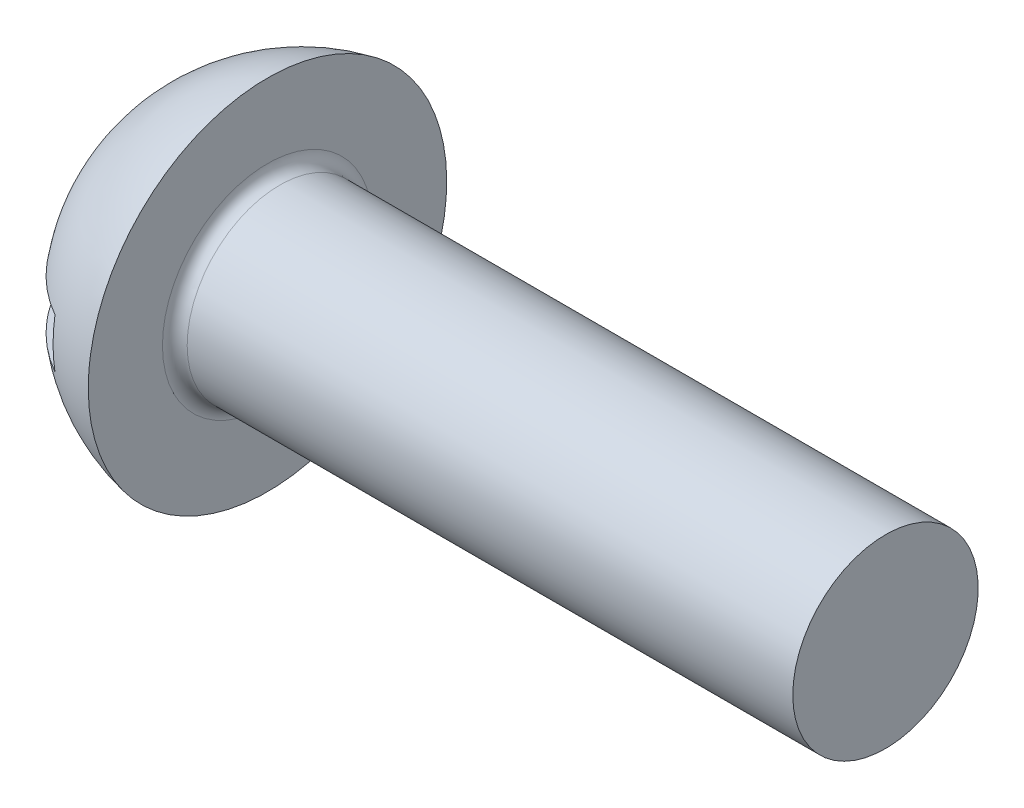
ISO-10303-21;
HEADER;
FILE_DESCRIPTION(('STEP AP214'),'2;1');
FILE_NAME('part.step','',(''),(''),'','','');
FILE_SCHEMA(('AUTOMOTIVE_DESIGN { 1 0 10303 214 1 1 1 1 }'));
ENDSEC;
DATA;
#1=APPLICATION_CONTEXT('core data for automotive mechanical design processes');
#2=APPLICATION_PROTOCOL_DEFINITION('international standard','automotive_design',2000,#1);
#3=PRODUCT_CONTEXT('',#1,'mechanical');
#4=PRODUCT('Part','Part','',(#3));
#5=PRODUCT_RELATED_PRODUCT_CATEGORY('part','',(#4));
#6=PRODUCT_DEFINITION_FORMATION('','',#4);
#7=PRODUCT_DEFINITION_CONTEXT('part definition',#1,'design');
#8=PRODUCT_DEFINITION('design','',#6,#7);
#9=PRODUCT_DEFINITION_SHAPE('','',#8);
#10=(LENGTH_UNIT() NAMED_UNIT(*) SI_UNIT(.MILLI.,.METRE.));
#11=(NAMED_UNIT(*) PLANE_ANGLE_UNIT() SI_UNIT($,.RADIAN.));
#12=(NAMED_UNIT(*) SI_UNIT($,.STERADIAN.) SOLID_ANGLE_UNIT());
#13=UNCERTAINTY_MEASURE_WITH_UNIT(LENGTH_MEASURE(1.E-05),#10,'distance_accuracy_value','');
#14=(GEOMETRIC_REPRESENTATION_CONTEXT(3) GLOBAL_UNCERTAINTY_ASSIGNED_CONTEXT((#13)) GLOBAL_UNIT_ASSIGNED_CONTEXT((#10,
#11,#12)) REPRESENTATION_CONTEXT('',''));
#15=CARTESIAN_POINT('',(0.,0.,0.));
#16=DIRECTION('',(0.,0.,1.));
#17=DIRECTION('',(1.,0.,0.));
#18=AXIS2_PLACEMENT_3D('',#15,#16,#17);
#19=CARTESIAN_POINT('',(2.95208333333333,0.,0.));
#20=DIRECTION('',(-1.,0.,0.));
#21=DIRECTION('',(0.,1.,0.));
#22=AXIS2_PLACEMENT_3D('',#19,#20,#21);
#23=SPHERICAL_SURFACE('',#22,2.95208333333333);
#24=CARTESIAN_POINT('',(2.95208333333333,0.4,0.));
#25=DIRECTION('',(0.,-1.,0.));
#26=DIRECTION('',(0.,0.,-1.));
#27=AXIS2_PLACEMENT_3D('',#24,#25,#26);
#28=CIRCLE('',#27,2.92485828835252);
#29=CARTESIAN_POINT('',(1.5,0.4,2.53894663197161));
#30=VERTEX_POINT('',#29);
#31=CARTESIAN_POINT('',(1.5,0.4,-2.53894663197161));
#32=VERTEX_POINT('',#31);
#33=EDGE_CURVE('E79',#30,#32,#28,.T.);
#34=ORIENTED_EDGE('',*,*,#33,.F.);
#35=CARTESIAN_POINT('',(1.5,0.,0.));
#36=DIRECTION('',(1.,0.,0.));
#37=DIRECTION('',(0.,0.,-1.));
#38=AXIS2_PLACEMENT_3D('',#35,#36,#37);
#39=CIRCLE('',#38,2.57026263249498);
#40=CARTESIAN_POINT('',(1.5,-0.4,2.53894663197161));
#41=VERTEX_POINT('',#40);
#42=EDGE_CURVE('E73',#30,#41,#39,.T.);
#43=ORIENTED_EDGE('',*,*,#42,.T.);
#44=CARTESIAN_POINT('',(2.95208333333333,-0.4,0.));
#45=DIRECTION('',(0.,1.,0.));
#46=DIRECTION('',(0.,0.,1.));
#47=AXIS2_PLACEMENT_3D('',#44,#45,#46);
#48=CIRCLE('',#47,2.92485828835252);
#49=CARTESIAN_POINT('',(1.5,-0.4,-2.53894663197161));
#50=VERTEX_POINT('',#49);
#51=EDGE_CURVE('E85',#50,#41,#48,.T.);
#52=ORIENTED_EDGE('',*,*,#51,.F.);
#53=EDGE_CURVE('E66',#50,#32,#39,.T.);
#54=ORIENTED_EDGE('',*,*,#53,.T.);
#55=EDGE_LOOP('',(#34,#43,#52,#54));
#56=FACE_BOUND('',#55,.T.);
#57=CARTESIAN_POINT('',(2.4,0.,0.));
#58=DIRECTION('',(-1.,0.,0.));
#59=DIRECTION('',(0.,0.,1.));
#60=AXIS2_PLACEMENT_3D('',#57,#58,#59);
#61=CIRCLE('',#60,2.9);
#62=CARTESIAN_POINT('',(2.4,0.,2.9));
#63=VERTEX_POINT('',#62);
#64=EDGE_CURVE('E130',#63,#63,#61,.T.);
#65=ORIENTED_EDGE('',*,*,#64,.T.);
#66=EDGE_LOOP('',(#65));
#67=FACE_BOUND('',#66,.T.);
#68=ADVANCED_FACE('F45',(#56,#67),#23,.T.);
#69=CARTESIAN_POINT('',(2.4,2.9,0.));
#70=DIRECTION('',(-1.,0.,0.));
#71=DIRECTION('',(0.,0.,1.));
#72=AXIS2_PLACEMENT_3D('',#69,#70,#71);
#73=PLANE('',#72);
#74=CARTESIAN_POINT('',(2.4,0.,0.));
#75=DIRECTION('',(-1.,0.,0.));
#76=DIRECTION('',(0.,0.,1.));
#77=AXIS2_PLACEMENT_3D('',#74,#75,#76);
#78=CIRCLE('',#77,1.7);
#79=CARTESIAN_POINT('',(2.4,0.,1.7));
#80=VERTEX_POINT('',#79);
#81=EDGE_CURVE('E54',#80,#80,#78,.T.);
#82=ORIENTED_EDGE('',*,*,#81,.T.);
#83=EDGE_LOOP('',(#82));
#84=FACE_BOUND('',#83,.T.);
#85=ORIENTED_EDGE('',*,*,#64,.F.);
#86=EDGE_LOOP('',(#85));
#87=FACE_BOUND('',#86,.T.);
#88=ADVANCED_FACE('F94',(#84,#87),#73,.F.);
#89=CARTESIAN_POINT('',(0.,0.,0.));
#90=DIRECTION('',(-1.,0.,0.));
#91=DIRECTION('',(0.,0.,1.));
#92=AXIS2_PLACEMENT_3D('',#89,#90,#91);
#93=CYLINDRICAL_SURFACE('',#92,1.5);
#94=CARTESIAN_POINT('',(2.6,0.,0.));
#95=DIRECTION('',(-1.,0.,0.));
#96=DIRECTION('',(0.,0.,1.));
#97=AXIS2_PLACEMENT_3D('',#94,#95,#96);
#98=CIRCLE('',#97,1.5);
#99=CARTESIAN_POINT('',(2.6,0.,1.5));
#100=VERTEX_POINT('',#99);
#101=EDGE_CURVE('E11',#100,#100,#98,.F.);
#102=ORIENTED_EDGE('',*,*,#101,.T.);
#103=EDGE_LOOP('',(#102));
#104=FACE_BOUND('',#103,.T.);
#105=CARTESIAN_POINT('',(12.4,0.,0.));
#106=DIRECTION('',(-1.,0.,0.));
#107=DIRECTION('',(0.,0.,1.));
#108=AXIS2_PLACEMENT_3D('',#105,#106,#107);
#109=CIRCLE('',#108,1.5);
#110=CARTESIAN_POINT('',(12.4,0.,1.5));
#111=VERTEX_POINT('',#110);
#112=EDGE_CURVE('E126',#111,#111,#109,.T.);
#113=ORIENTED_EDGE('',*,*,#112,.T.);
#114=EDGE_LOOP('',(#113));
#115=FACE_BOUND('',#114,.T.);
#116=ADVANCED_FACE('F112',(#104,#115),#93,.T.);
#117=CARTESIAN_POINT('',(12.4,1.5,0.));
#118=DIRECTION('',(-1.,0.,0.));
#119=DIRECTION('',(0.,0.,1.));
#120=AXIS2_PLACEMENT_3D('',#117,#118,#119);
#121=PLANE('',#120);
#122=ORIENTED_EDGE('',*,*,#112,.F.);
#123=EDGE_LOOP('',(#122));
#124=FACE_BOUND('',#123,.T.);
#125=ADVANCED_FACE('F117',(#124),#121,.F.);
#126=CARTESIAN_POINT('',(1.5,0.4,-2.9));
#127=DIRECTION('',(0.,-1.,0.));
#128=DIRECTION('',(0.,0.,-1.));
#129=AXIS2_PLACEMENT_3D('',#126,#127,#128);
#130=PLANE('',#129);
#131=ORIENTED_EDGE('',*,*,#33,.T.);
#132=DIRECTION('',(0.,0.,1.));
#133=VECTOR('',#132,1.);
#134=CARTESIAN_POINT('',(1.5,0.4,-2.9));
#135=LINE('',#134,#133);
#136=EDGE_CURVE('E61',#32,#30,#135,.T.);
#137=ORIENTED_EDGE('',*,*,#136,.T.);
#138=EDGE_LOOP('',(#131,#137));
#139=FACE_BOUND('',#138,.T.);
#140=ADVANCED_FACE('F82',(#139),#130,.T.);
#141=CARTESIAN_POINT('',(1.5,-0.4,2.9));
#142=DIRECTION('',(0.,1.,0.));
#143=DIRECTION('',(0.,0.,1.));
#144=AXIS2_PLACEMENT_3D('',#141,#142,#143);
#145=PLANE('',#144);
#146=ORIENTED_EDGE('',*,*,#51,.T.);
#147=DIRECTION('',(0.,0.,-1.));
#148=VECTOR('',#147,1.);
#149=CARTESIAN_POINT('',(1.5,-0.4,2.9));
#150=LINE('',#149,#148);
#151=EDGE_CURVE('E75',#41,#50,#150,.T.);
#152=ORIENTED_EDGE('',*,*,#151,.T.);
#153=EDGE_LOOP('',(#146,#152));
#154=FACE_BOUND('',#153,.T.);
#155=ADVANCED_FACE('F103',(#154),#145,.T.);
#156=CARTESIAN_POINT('',(1.5,0.4,-2.9));
#157=DIRECTION('',(1.,0.,0.));
#158=DIRECTION('',(0.,0.,-1.));
#159=AXIS2_PLACEMENT_3D('',#156,#157,#158);
#160=PLANE('',#159);
#161=ORIENTED_EDGE('',*,*,#136,.F.);
#162=ORIENTED_EDGE('',*,*,#53,.F.);
#163=ORIENTED_EDGE('',*,*,#151,.F.);
#164=ORIENTED_EDGE('',*,*,#42,.F.);
#165=EDGE_LOOP('',(#161,#162,#163,#164));
#166=FACE_BOUND('',#165,.T.);
#167=ADVANCED_FACE('F74',(#166),#160,.F.);
#168=CARTESIAN_POINT('',(2.6,0.,0.));
#169=DIRECTION('',(-1.,0.,0.));
#170=DIRECTION('',(0.,0.,1.));
#171=AXIS2_PLACEMENT_3D('',#168,#169,#170);
#172=TOROIDAL_SURFACE('',#171,1.7,0.2);
#173=ORIENTED_EDGE('',*,*,#101,.F.);
#174=EDGE_LOOP('',(#173));
#175=FACE_BOUND('',#174,.T.);
#176=ORIENTED_EDGE('',*,*,#81,.F.);
#177=EDGE_LOOP('',(#176));
#178=FACE_BOUND('',#177,.T.);
#179=ADVANCED_FACE('F47',(#175,#178),#172,.F.);
#180=CLOSED_SHELL('',(#68,#88,#116,#125,#140,#155,#167,#179));
#181=MANIFOLD_SOLID_BREP('B2',#180);
#182=ADVANCED_BREP_SHAPE_REPRESENTATION('',(#18,#181),#14);
#183=SHAPE_DEFINITION_REPRESENTATION(#9,#182);
ENDSEC;
END-ISO-10303-21;
